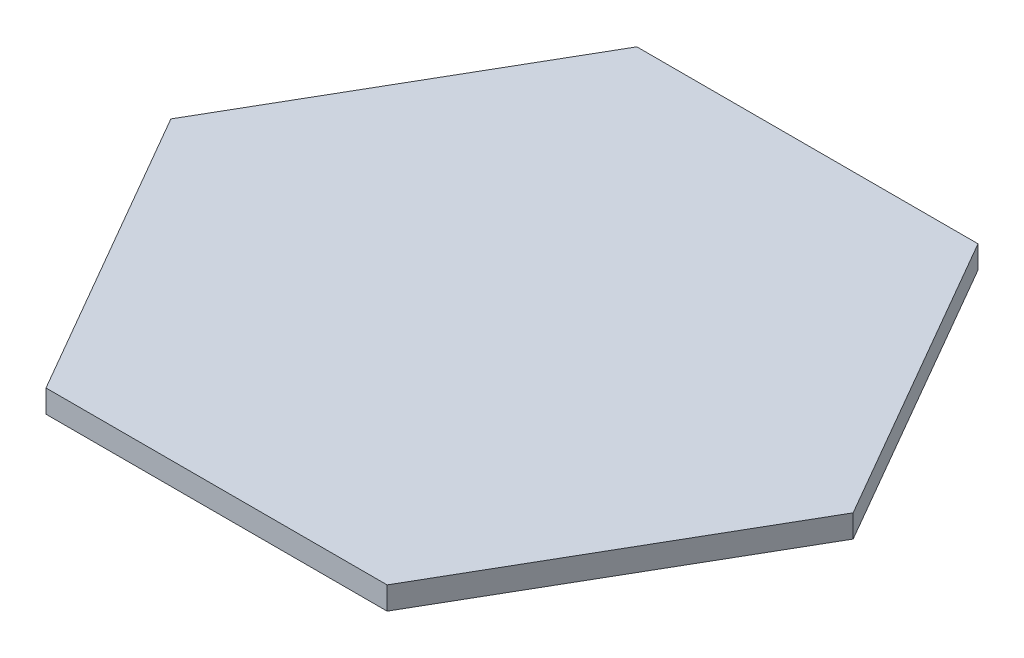
ISO-10303-21;
HEADER;
FILE_DESCRIPTION(('STEP AP214'),'2;1');
FILE_NAME('part.step','',(''),(''),'','','');
FILE_SCHEMA(('AUTOMOTIVE_DESIGN { 1 0 10303 214 1 1 1 1 }'));
ENDSEC;
DATA;
#1=APPLICATION_CONTEXT('core data for automotive mechanical design processes');
#2=APPLICATION_PROTOCOL_DEFINITION('international standard','automotive_design',2000,#1);
#3=PRODUCT_CONTEXT('',#1,'mechanical');
#4=PRODUCT('Part','Part','',(#3));
#5=PRODUCT_RELATED_PRODUCT_CATEGORY('part','',(#4));
#6=PRODUCT_DEFINITION_FORMATION('','',#4);
#7=PRODUCT_DEFINITION_CONTEXT('part definition',#1,'design');
#8=PRODUCT_DEFINITION('design','',#6,#7);
#9=PRODUCT_DEFINITION_SHAPE('','',#8);
#10=(LENGTH_UNIT() NAMED_UNIT(*) SI_UNIT(.MILLI.,.METRE.));
#11=(NAMED_UNIT(*) PLANE_ANGLE_UNIT() SI_UNIT($,.RADIAN.));
#12=(NAMED_UNIT(*) SI_UNIT($,.STERADIAN.) SOLID_ANGLE_UNIT());
#13=UNCERTAINTY_MEASURE_WITH_UNIT(LENGTH_MEASURE(1.E-05),#10,'distance_accuracy_value','');
#14=(GEOMETRIC_REPRESENTATION_CONTEXT(3) GLOBAL_UNCERTAINTY_ASSIGNED_CONTEXT((#13)) GLOBAL_UNIT_ASSIGNED_CONTEXT((#10,
#11,#12)) REPRESENTATION_CONTEXT('',''));
#15=CARTESIAN_POINT('',(0.,0.,0.));
#16=DIRECTION('',(0.,0.,1.));
#17=DIRECTION('',(1.,0.,0.));
#18=AXIS2_PLACEMENT_3D('',#15,#16,#17);
#19=CARTESIAN_POINT('',(15.,2.,25.9807621135332));
#20=DIRECTION('',(-0.866025403784439,0.,-0.5));
#21=DIRECTION('',(-0.5,0.,0.866025403784439));
#22=AXIS2_PLACEMENT_3D('',#19,#20,#21);
#23=PLANE('',#22);
#24=DIRECTION('',(0.5,0.,-0.866025403784439));
#25=VECTOR('',#24,1.);
#26=CARTESIAN_POINT('',(15.,0.,25.9807621135332));
#27=LINE('',#26,#25);
#28=CARTESIAN_POINT('',(15.,0.,25.9807621135332));
#29=VERTEX_POINT('',#28);
#30=CARTESIAN_POINT('',(30.,0.,0.));
#31=VERTEX_POINT('',#30);
#32=EDGE_CURVE('E119',#29,#31,#27,.T.);
#33=ORIENTED_EDGE('',*,*,#32,.T.);
#34=DIRECTION('',(0.,-1.,0.));
#35=VECTOR('',#34,1.);
#36=CARTESIAN_POINT('',(30.,2.,0.));
#37=LINE('',#36,#35);
#38=CARTESIAN_POINT('',(30.,2.,0.));
#39=VERTEX_POINT('',#38);
#40=EDGE_CURVE('E11',#39,#31,#37,.T.);
#41=ORIENTED_EDGE('',*,*,#40,.F.);
#42=DIRECTION('',(0.5,0.,-0.866025403784439));
#43=VECTOR('',#42,1.);
#44=CARTESIAN_POINT('',(15.,2.,25.9807621135332));
#45=LINE('',#44,#43);
#46=CARTESIAN_POINT('',(15.,2.,25.9807621135332));
#47=VERTEX_POINT('',#46);
#48=EDGE_CURVE('E129',#47,#39,#45,.T.);
#49=ORIENTED_EDGE('',*,*,#48,.F.);
#50=DIRECTION('',(0.,-1.,0.));
#51=VECTOR('',#50,1.);
#52=CARTESIAN_POINT('',(15.,2.,25.9807621135332));
#53=LINE('',#52,#51);
#54=EDGE_CURVE('E115',#47,#29,#53,.T.);
#55=ORIENTED_EDGE('',*,*,#54,.T.);
#56=EDGE_LOOP('',(#33,#41,#49,#55));
#57=FACE_BOUND('',#56,.T.);
#58=ADVANCED_FACE('F35',(#57),#23,.F.);
#59=CARTESIAN_POINT('',(30.,2.,0.));
#60=DIRECTION('',(-0.866025403784439,0.,0.5));
#61=DIRECTION('',(0.5,0.,0.866025403784439));
#62=AXIS2_PLACEMENT_3D('',#59,#60,#61);
#63=PLANE('',#62);
#64=DIRECTION('',(-0.5,0.,-0.866025403784439));
#65=VECTOR('',#64,1.);
#66=CARTESIAN_POINT('',(30.,0.,0.));
#67=LINE('',#66,#65);
#68=CARTESIAN_POINT('',(15.,0.,-25.9807621135332));
#69=VERTEX_POINT('',#68);
#70=EDGE_CURVE('E122',#31,#69,#67,.T.);
#71=ORIENTED_EDGE('',*,*,#70,.T.);
#72=DIRECTION('',(0.,-1.,0.));
#73=VECTOR('',#72,1.);
#74=CARTESIAN_POINT('',(15.,2.,-25.9807621135332));
#75=LINE('',#74,#73);
#76=CARTESIAN_POINT('',(15.,2.,-25.9807621135332));
#77=VERTEX_POINT('',#76);
#78=EDGE_CURVE('E43',#77,#69,#75,.T.);
#79=ORIENTED_EDGE('',*,*,#78,.F.);
#80=DIRECTION('',(-0.5,0.,-0.866025403784439));
#81=VECTOR('',#80,1.);
#82=CARTESIAN_POINT('',(30.,2.,0.));
#83=LINE('',#82,#81);
#84=EDGE_CURVE('E88',#39,#77,#83,.T.);
#85=ORIENTED_EDGE('',*,*,#84,.F.);
#86=ORIENTED_EDGE('',*,*,#40,.T.);
#87=EDGE_LOOP('',(#71,#79,#85,#86));
#88=FACE_BOUND('',#87,.T.);
#89=ADVANCED_FACE('F153',(#88),#63,.F.);
#90=CARTESIAN_POINT('',(15.,2.,-25.9807621135332));
#91=DIRECTION('',(0.,0.,1.));
#92=DIRECTION('',(1.,0.,0.));
#93=AXIS2_PLACEMENT_3D('',#90,#91,#92);
#94=PLANE('',#93);
#95=DIRECTION('',(-1.,0.,0.));
#96=VECTOR('',#95,1.);
#97=CARTESIAN_POINT('',(15.,0.,-25.9807621135332));
#98=LINE('',#97,#96);
#99=CARTESIAN_POINT('',(-15.,0.,-25.9807621135332));
#100=VERTEX_POINT('',#99);
#101=EDGE_CURVE('E124',#69,#100,#98,.T.);
#102=ORIENTED_EDGE('',*,*,#101,.T.);
#103=DIRECTION('',(0.,-1.,0.));
#104=VECTOR('',#103,1.);
#105=CARTESIAN_POINT('',(-15.,2.,-25.9807621135332));
#106=LINE('',#105,#104);
#107=CARTESIAN_POINT('',(-15.,2.,-25.9807621135332));
#108=VERTEX_POINT('',#107);
#109=EDGE_CURVE('E110',#108,#100,#106,.T.);
#110=ORIENTED_EDGE('',*,*,#109,.F.);
#111=DIRECTION('',(-1.,0.,0.));
#112=VECTOR('',#111,1.);
#113=CARTESIAN_POINT('',(15.,2.,-25.9807621135332));
#114=LINE('',#113,#112);
#115=EDGE_CURVE('E101',#77,#108,#114,.T.);
#116=ORIENTED_EDGE('',*,*,#115,.F.);
#117=ORIENTED_EDGE('',*,*,#78,.T.);
#118=EDGE_LOOP('',(#102,#110,#116,#117));
#119=FACE_BOUND('',#118,.T.);
#120=ADVANCED_FACE('F135',(#119),#94,.F.);
#121=CARTESIAN_POINT('',(-15.,2.,-25.9807621135332));
#122=DIRECTION('',(0.866025403784439,0.,0.5));
#123=DIRECTION('',(0.5,0.,-0.866025403784439));
#124=AXIS2_PLACEMENT_3D('',#121,#122,#123);
#125=PLANE('',#124);
#126=DIRECTION('',(-0.5,0.,0.866025403784439));
#127=VECTOR('',#126,1.);
#128=CARTESIAN_POINT('',(-15.,0.,-25.9807621135332));
#129=LINE('',#128,#127);
#130=CARTESIAN_POINT('',(-30.,0.,0.));
#131=VERTEX_POINT('',#130);
#132=EDGE_CURVE('E109',#100,#131,#129,.T.);
#133=ORIENTED_EDGE('',*,*,#132,.T.);
#134=DIRECTION('',(0.,-1.,0.));
#135=VECTOR('',#134,1.);
#136=CARTESIAN_POINT('',(-30.,2.,0.));
#137=LINE('',#136,#135);
#138=CARTESIAN_POINT('',(-30.,2.,0.));
#139=VERTEX_POINT('',#138);
#140=EDGE_CURVE('E106',#139,#131,#137,.T.);
#141=ORIENTED_EDGE('',*,*,#140,.F.);
#142=DIRECTION('',(-0.5,0.,0.866025403784439));
#143=VECTOR('',#142,1.);
#144=CARTESIAN_POINT('',(-15.,2.,-25.9807621135332));
#145=LINE('',#144,#143);
#146=EDGE_CURVE('E95',#108,#139,#145,.T.);
#147=ORIENTED_EDGE('',*,*,#146,.F.);
#148=ORIENTED_EDGE('',*,*,#109,.T.);
#149=EDGE_LOOP('',(#133,#141,#147,#148));
#150=FACE_BOUND('',#149,.T.);
#151=ADVANCED_FACE('F107',(#150),#125,.F.);
#152=CARTESIAN_POINT('',(-30.,2.,0.));
#153=DIRECTION('',(0.866025403784439,0.,-0.5));
#154=DIRECTION('',(-0.5,0.,-0.866025403784439));
#155=AXIS2_PLACEMENT_3D('',#152,#153,#154);
#156=PLANE('',#155);
#157=DIRECTION('',(0.5,0.,0.866025403784439));
#158=VECTOR('',#157,1.);
#159=CARTESIAN_POINT('',(-30.,0.,0.));
#160=LINE('',#159,#158);
#161=CARTESIAN_POINT('',(-15.,0.,25.9807621135331));
#162=VERTEX_POINT('',#161);
#163=EDGE_CURVE('E74',#131,#162,#160,.T.);
#164=ORIENTED_EDGE('',*,*,#163,.T.);
#165=DIRECTION('',(0.,-1.,0.));
#166=VECTOR('',#165,1.);
#167=CARTESIAN_POINT('',(-15.,2.,25.9807621135331));
#168=LINE('',#167,#166);
#169=CARTESIAN_POINT('',(-15.,2.,25.9807621135331));
#170=VERTEX_POINT('',#169);
#171=EDGE_CURVE('E111',#170,#162,#168,.T.);
#172=ORIENTED_EDGE('',*,*,#171,.F.);
#173=DIRECTION('',(0.5,0.,0.866025403784439));
#174=VECTOR('',#173,1.);
#175=CARTESIAN_POINT('',(-30.,2.,0.));
#176=LINE('',#175,#174);
#177=EDGE_CURVE('E99',#139,#170,#176,.T.);
#178=ORIENTED_EDGE('',*,*,#177,.F.);
#179=ORIENTED_EDGE('',*,*,#140,.T.);
#180=EDGE_LOOP('',(#164,#172,#178,#179));
#181=FACE_BOUND('',#180,.T.);
#182=ADVANCED_FACE('F113',(#181),#156,.F.);
#183=CARTESIAN_POINT('',(-15.,2.,25.9807621135331));
#184=DIRECTION('',(0.,0.,-1.));
#185=DIRECTION('',(-1.,0.,0.));
#186=AXIS2_PLACEMENT_3D('',#183,#184,#185);
#187=PLANE('',#186);
#188=DIRECTION('',(1.,0.,0.));
#189=VECTOR('',#188,1.);
#190=CARTESIAN_POINT('',(-15.,0.,25.9807621135331));
#191=LINE('',#190,#189);
#192=EDGE_CURVE('E80',#162,#29,#191,.T.);
#193=ORIENTED_EDGE('',*,*,#192,.T.);
#194=ORIENTED_EDGE('',*,*,#54,.F.);
#195=DIRECTION('',(1.,0.,0.));
#196=VECTOR('',#195,1.);
#197=CARTESIAN_POINT('',(-15.,2.,25.9807621135331));
#198=LINE('',#197,#196);
#199=EDGE_CURVE('E51',#170,#47,#198,.T.);
#200=ORIENTED_EDGE('',*,*,#199,.F.);
#201=ORIENTED_EDGE('',*,*,#171,.T.);
#202=EDGE_LOOP('',(#193,#194,#200,#201));
#203=FACE_BOUND('',#202,.T.);
#204=ADVANCED_FACE('F142',(#203),#187,.F.);
#205=CARTESIAN_POINT('',(0.,2.,0.));
#206=DIRECTION('',(0.,1.,0.));
#207=DIRECTION('',(0.,0.,1.));
#208=AXIS2_PLACEMENT_3D('',#205,#206,#207);
#209=PLANE('',#208);
#210=ORIENTED_EDGE('',*,*,#48,.T.);
#211=ORIENTED_EDGE('',*,*,#84,.T.);
#212=ORIENTED_EDGE('',*,*,#115,.T.);
#213=ORIENTED_EDGE('',*,*,#146,.T.);
#214=ORIENTED_EDGE('',*,*,#177,.T.);
#215=ORIENTED_EDGE('',*,*,#199,.T.);
#216=EDGE_LOOP('',(#210,#211,#212,#213,#214,#215));
#217=FACE_BOUND('',#216,.T.);
#218=ADVANCED_FACE('F97',(#217),#209,.T.);
#219=CARTESIAN_POINT('',(0.,0.,0.));
#220=DIRECTION('',(0.,1.,0.));
#221=DIRECTION('',(0.,0.,1.));
#222=AXIS2_PLACEMENT_3D('',#219,#220,#221);
#223=PLANE('',#222);
#224=ORIENTED_EDGE('',*,*,#32,.F.);
#225=ORIENTED_EDGE('',*,*,#192,.F.);
#226=ORIENTED_EDGE('',*,*,#163,.F.);
#227=ORIENTED_EDGE('',*,*,#132,.F.);
#228=ORIENTED_EDGE('',*,*,#101,.F.);
#229=ORIENTED_EDGE('',*,*,#70,.F.);
#230=EDGE_LOOP('',(#224,#225,#226,#227,#228,#229));
#231=FACE_BOUND('',#230,.T.);
#232=ADVANCED_FACE('F138',(#231),#223,.F.);
#233=CLOSED_SHELL('',(#58,#89,#120,#151,#182,#204,#218,#232));
#234=MANIFOLD_SOLID_BREP('B2',#233);
#235=ADVANCED_BREP_SHAPE_REPRESENTATION('',(#18,#234),#14);
#236=SHAPE_DEFINITION_REPRESENTATION(#9,#235);
ENDSEC;
END-ISO-10303-21;
